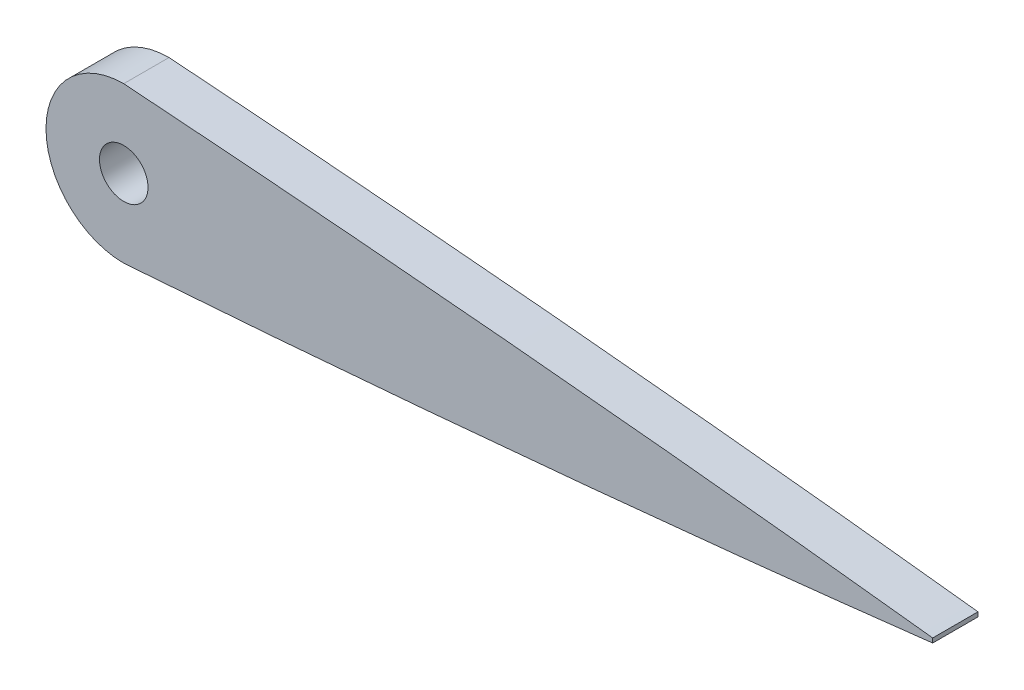
ISO-10303-21;
HEADER;
FILE_DESCRIPTION(('STEP AP214'),'2;1');
FILE_NAME('part.step','',(''),(''),'','','');
FILE_SCHEMA(('AUTOMOTIVE_DESIGN { 1 0 10303 214 1 1 1 1 }'));
ENDSEC;
DATA;
#1=APPLICATION_CONTEXT('core data for automotive mechanical design processes');
#2=APPLICATION_PROTOCOL_DEFINITION('international standard','automotive_design',2000,#1);
#3=PRODUCT_CONTEXT('',#1,'mechanical');
#4=PRODUCT('Part','Part','',(#3));
#5=PRODUCT_RELATED_PRODUCT_CATEGORY('part','',(#4));
#6=PRODUCT_DEFINITION_FORMATION('','',#4);
#7=PRODUCT_DEFINITION_CONTEXT('part definition',#1,'design');
#8=PRODUCT_DEFINITION('design','',#6,#7);
#9=PRODUCT_DEFINITION_SHAPE('','',#8);
#10=(LENGTH_UNIT() NAMED_UNIT(*) SI_UNIT(.MILLI.,.METRE.));
#11=(NAMED_UNIT(*) PLANE_ANGLE_UNIT() SI_UNIT($,.RADIAN.));
#12=(NAMED_UNIT(*) SI_UNIT($,.STERADIAN.) SOLID_ANGLE_UNIT());
#13=UNCERTAINTY_MEASURE_WITH_UNIT(LENGTH_MEASURE(1.E-05),#10,'distance_accuracy_value','');
#14=(GEOMETRIC_REPRESENTATION_CONTEXT(3) GLOBAL_UNCERTAINTY_ASSIGNED_CONTEXT((#13)) GLOBAL_UNIT_ASSIGNED_CONTEXT((#10,
#11,#12)) REPRESENTATION_CONTEXT('',''));
#15=CARTESIAN_POINT('',(0.,0.,0.));
#16=DIRECTION('',(0.,0.,1.));
#17=DIRECTION('',(1.,0.,0.));
#18=AXIS2_PLACEMENT_3D('',#15,#16,#17);
#19=CARTESIAN_POINT('',(150.,0.,1.4));
#20=DIRECTION('',(0.,0.,-1.));
#21=DIRECTION('',(-1.,0.,0.));
#22=AXIS2_PLACEMENT_3D('',#19,#20,#21);
#23=CYLINDRICAL_SURFACE('',#22,4.80461384587043);
#24=CARTESIAN_POINT('',(150.,0.,-1.4));
#25=DIRECTION('',(0.,0.,1.));
#26=DIRECTION('',(1.,0.,0.));
#27=AXIS2_PLACEMENT_3D('',#24,#25,#26);
#28=CIRCLE('',#27,4.80461384587043);
#29=CARTESIAN_POINT('',(150.,4.80461384587043,-1.4));
#30=VERTEX_POINT('',#29);
#31=CARTESIAN_POINT('',(150.,-4.80461384587043,-1.4));
#32=VERTEX_POINT('',#31);
#33=EDGE_CURVE('E136',#30,#32,#28,.T.);
#34=ORIENTED_EDGE('',*,*,#33,.T.);
#35=DIRECTION('',(0.,0.,-1.));
#36=VECTOR('',#35,1.);
#37=CARTESIAN_POINT('',(150.,-4.80461384587043,1.4));
#38=LINE('',#37,#36);
#39=CARTESIAN_POINT('',(150.,-4.80461384587043,1.4));
#40=VERTEX_POINT('',#39);
#41=EDGE_CURVE('E11',#40,#32,#38,.T.);
#42=ORIENTED_EDGE('',*,*,#41,.F.);
#43=CARTESIAN_POINT('',(150.,0.,1.4));
#44=DIRECTION('',(0.,0.,1.));
#45=DIRECTION('',(1.,0.,0.));
#46=AXIS2_PLACEMENT_3D('',#43,#44,#45);
#47=CIRCLE('',#46,4.80461384587043);
#48=CARTESIAN_POINT('',(150.,4.80461384587043,1.4));
#49=VERTEX_POINT('',#48);
#50=EDGE_CURVE('E90',#49,#40,#47,.T.);
#51=ORIENTED_EDGE('',*,*,#50,.F.);
#52=DIRECTION('',(0.,0.,-1.));
#53=VECTOR('',#52,1.);
#54=CARTESIAN_POINT('',(150.,4.80461384587043,1.4));
#55=LINE('',#54,#53);
#56=EDGE_CURVE('E105',#49,#30,#55,.T.);
#57=ORIENTED_EDGE('',*,*,#56,.T.);
#58=EDGE_LOOP('',(#34,#42,#51,#57));
#59=FACE_BOUND('',#58,.T.);
#60=ADVANCED_FACE('F41',(#59),#23,.T.);
#61=CARTESIAN_POINT('',(70.,0.,1.4));
#62=CARTESIAN_POINT('',(70.0210891933104,-0.181022277756236,1.4));
#63=CARTESIAN_POINT('',(70.0654115784545,-0.561470168591621,1.4));
#64=CARTESIAN_POINT('',(70.4054651376767,-1.09128863854025,1.4));
#65=CARTESIAN_POINT('',(70.9148454368871,-1.58948341349259,1.4));
#66=CARTESIAN_POINT('',(71.6134039414976,-2.06570488459065,1.4));
#67=CARTESIAN_POINT('',(72.4904852213431,-2.52300118187618,1.4));
#68=CARTESIAN_POINT('',(73.5466597857126,-2.96175212088492,1.4));
#69=CARTESIAN_POINT('',(74.777626786561,-3.38106476585515,1.4));
#70=CARTESIAN_POINT('',(76.1798269249892,-3.77961054900821,1.4));
#71=CARTESIAN_POINT('',(77.7488483274916,-4.15602159944256,1.4));
#72=CARTESIAN_POINT('',(79.480180391605,-4.50879808021636,1.4));
#73=CARTESIAN_POINT('',(81.3690703368048,-4.83650935330272,1.4));
#74=CARTESIAN_POINT('',(83.4106173030528,-5.13779143733033,1.4));
#75=CARTESIAN_POINT('',(85.5997871715192,-5.41138329617955,1.4));
#76=CARTESIAN_POINT('',(87.9314069199584,-5.65613219952653,1.4));
#77=CARTESIAN_POINT('',(90.4001654328243,-5.87110935567024,1.4));
#78=CARTESIAN_POINT('',(93.0006274247381,-6.05546036807817,1.4));
#79=CARTESIAN_POINT('',(95.7272036399974,-6.20862837049385,1.4));
#80=CARTESIAN_POINT('',(98.5741712322572,-6.3302245705325,1.4));
#81=CARTESIAN_POINT('',(101.535643119364,-6.42009288153795,1.4));
#82=CARTESIAN_POINT('',(104.60557157804,-6.47822791192431,1.4));
#83=CARTESIAN_POINT('',(107.777727308731,-6.50498815144425,1.4));
#84=CARTESIAN_POINT('',(111.04570099436,-6.5007667704824,1.4));
#85=CARTESIAN_POINT('',(114.40287335376,-6.4663175065826,1.4));
#86=CARTESIAN_POINT('',(117.842409031342,-6.40248972539943,1.4));
#87=CARTESIAN_POINT('',(121.357229155619,-6.31032058029897,1.4));
#88=CARTESIAN_POINT('',(124.940008831239,-6.19102708290984,1.4));
#89=CARTESIAN_POINT('',(128.583123626476,-6.04593163572366,1.4));
#90=CARTESIAN_POINT('',(132.278649950781,-5.8764622181101,1.4));
#91=CARTESIAN_POINT('',(136.018308786906,-5.68413937527898,1.4));
#92=CARTESIAN_POINT('',(139.793458583577,-5.47057350130732,1.4));
#93=CARTESIAN_POINT('',(143.595021076551,-5.23737347030647,1.4));
#94=CARTESIAN_POINT('',(147.413453453648,-4.98624509086135,1.4));
#95=CARTESIAN_POINT('',(151.238665748325,-4.71889644121469,1.4));
#96=CARTESIAN_POINT('',(155.059961592094,-4.43701048082576,1.4));
#97=CARTESIAN_POINT('',(158.865943792714,-4.14237984950792,1.4));
#98=CARTESIAN_POINT('',(162.644406172511,-3.83679790200338,1.4));
#99=CARTESIAN_POINT('',(166.382173560786,-3.52209133734546,1.4));
#100=CARTESIAN_POINT('',(170.064960651326,-3.2002273198148,1.4));
#101=CARTESIAN_POINT('',(173.677095759027,-2.87328435938489,1.4));
#102=CARTESIAN_POINT('',(177.201238614807,-2.54359186690204,1.4));
#103=CARTESIAN_POINT('',(180.617922245882,-2.21370342378747,1.4));
#104=CARTESIAN_POINT('',(183.904963564941,-1.88667328178701,1.4));
#105=CARTESIAN_POINT('',(187.036509642164,-1.56600799118508,1.4));
#106=CARTESIAN_POINT('',(189.981579717866,-1.25611146784962,1.4));
#107=CARTESIAN_POINT('',(192.701519493011,-0.962451868277504,1.4));
#108=CARTESIAN_POINT('',(195.145010046257,-0.6922914971175,1.4));
#109=CARTESIAN_POINT('',(197.235914613454,-0.45609848618737,1.4));
#110=CARTESIAN_POINT('',(198.816691219591,-0.274497570057536,1.4));
#111=CARTESIAN_POINT('',(199.688033420455,-0.17288156889324,1.4));
#112=CARTESIAN_POINT('',(200.,-0.1365,1.4));
#113=B_SPLINE_CURVE_WITH_KNOTS('',3,(#61,#62,#63,#64,#65,#66,#67,#68,#69,#70,#71,#72,#73,#74,
#75,#76,#77,#78,#79,#80,#81,#82,#83,#84,#85,#86,#87,#88,#89,#90,#91,#92,#93,#94,#95,#96,#97,#98,
#99,#100,#101,#102,#103,#104,#105,#106,#107,#108,#109,#110,#111,#112),.UNSPECIFIED.,.F.,.F.,(4,
1,1,1,1,1,1,1,1,1,1,1,1,1,1,1,1,1,1,1,1,1,1,1,1,1,1,1,1,1,1,1,1,1,1,1,1,1,1,1,1,1,1,1,1,1,1,1,1,
4),(0.,0.00409901119627067,0.00861474169622243,0.013934854724959,0.0202777746115639,
0.0277529807018305,0.0364102145151919,0.0462664329749759,0.057320237837208,0.0695589461393541,
0.0829628608595683,0.0975072182865541,0.113164081930894,0.129902689855954,0.147690303906216,
0.166492184642367,0.186271967143026,0.206991861424857,0.228612214931178,0.25109216492606,
0.274388983443375,0.298458209116087,0.323253842050884,0.348727970896163,0.374830386774719,
0.401509190431855,0.428710015672103,0.456376153594157,0.484448082863221,0.512863886613239,
0.541558094079446,0.570462312854758,0.599504247573885,0.628607348748546,0.657690446050344,
0.68666723740018,0.715444848929875,0.743923546361862,0.771994829811623,0.799540252867686,
0.826428321931678,0.852512114582347,0.877624445997917,0.901571133904992,0.924121062493777,
0.944988816236939,0.963803938777258,0.980044339265456,0.992855276358985,1.),.UNSPECIFIED.);
#114=DIRECTION('',(0.,0.,-1.));
#115=VECTOR('',#114,1.);
#116=SURFACE_OF_LINEAR_EXTRUSION('',#113,#115);
#117=CARTESIAN_POINT('',(70.,0.,-1.4));
#118=CARTESIAN_POINT('',(70.0210891933104,-0.181022277756236,-1.4));
#119=CARTESIAN_POINT('',(70.0654115784545,-0.561470168591621,-1.4));
#120=CARTESIAN_POINT('',(70.4054651376767,-1.09128863854025,-1.4));
#121=CARTESIAN_POINT('',(70.9148454368871,-1.58948341349259,-1.4));
#122=CARTESIAN_POINT('',(71.6134039414976,-2.06570488459065,-1.4));
#123=CARTESIAN_POINT('',(72.4904852213431,-2.52300118187618,-1.4));
#124=CARTESIAN_POINT('',(73.5466597857126,-2.96175212088492,-1.4));
#125=CARTESIAN_POINT('',(74.777626786561,-3.38106476585515,-1.4));
#126=CARTESIAN_POINT('',(76.1798269249892,-3.77961054900821,-1.4));
#127=CARTESIAN_POINT('',(77.7488483274916,-4.15602159944256,-1.4));
#128=CARTESIAN_POINT('',(79.480180391605,-4.50879808021636,-1.4));
#129=CARTESIAN_POINT('',(81.3690703368048,-4.83650935330272,-1.4));
#130=CARTESIAN_POINT('',(83.4106173030528,-5.13779143733033,-1.4));
#131=CARTESIAN_POINT('',(85.5997871715192,-5.41138329617955,-1.4));
#132=CARTESIAN_POINT('',(87.9314069199584,-5.65613219952653,-1.4));
#133=CARTESIAN_POINT('',(90.4001654328243,-5.87110935567024,-1.4));
#134=CARTESIAN_POINT('',(93.0006274247381,-6.05546036807817,-1.4));
#135=CARTESIAN_POINT('',(95.7272036399974,-6.20862837049385,-1.4));
#136=CARTESIAN_POINT('',(98.5741712322572,-6.3302245705325,-1.4));
#137=CARTESIAN_POINT('',(101.535643119364,-6.42009288153795,-1.4));
#138=CARTESIAN_POINT('',(104.60557157804,-6.47822791192431,-1.4));
#139=CARTESIAN_POINT('',(107.777727308731,-6.50498815144425,-1.4));
#140=CARTESIAN_POINT('',(111.04570099436,-6.5007667704824,-1.4));
#141=CARTESIAN_POINT('',(114.40287335376,-6.4663175065826,-1.4));
#142=CARTESIAN_POINT('',(117.842409031342,-6.40248972539943,-1.4));
#143=CARTESIAN_POINT('',(121.357229155619,-6.31032058029897,-1.4));
#144=CARTESIAN_POINT('',(124.940008831239,-6.19102708290984,-1.4));
#145=CARTESIAN_POINT('',(128.583123626476,-6.04593163572366,-1.4));
#146=CARTESIAN_POINT('',(132.278649950781,-5.8764622181101,-1.4));
#147=CARTESIAN_POINT('',(136.018308786906,-5.68413937527898,-1.4));
#148=CARTESIAN_POINT('',(139.793458583577,-5.47057350130732,-1.4));
#149=CARTESIAN_POINT('',(143.595021076551,-5.23737347030647,-1.4));
#150=CARTESIAN_POINT('',(147.413453453648,-4.98624509086135,-1.4));
#151=CARTESIAN_POINT('',(151.238665748325,-4.71889644121469,-1.4));
#152=CARTESIAN_POINT('',(155.059961592094,-4.43701048082576,-1.4));
#153=CARTESIAN_POINT('',(158.865943792714,-4.14237984950792,-1.4));
#154=CARTESIAN_POINT('',(162.644406172511,-3.83679790200338,-1.4));
#155=CARTESIAN_POINT('',(166.382173560786,-3.52209133734546,-1.4));
#156=CARTESIAN_POINT('',(170.064960651326,-3.2002273198148,-1.4));
#157=CARTESIAN_POINT('',(173.677095759027,-2.87328435938489,-1.4));
#158=CARTESIAN_POINT('',(177.201238614807,-2.54359186690204,-1.4));
#159=CARTESIAN_POINT('',(180.617922245882,-2.21370342378747,-1.4));
#160=CARTESIAN_POINT('',(183.904963564941,-1.88667328178701,-1.4));
#161=CARTESIAN_POINT('',(187.036509642164,-1.56600799118508,-1.4));
#162=CARTESIAN_POINT('',(189.981579717866,-1.25611146784962,-1.4));
#163=CARTESIAN_POINT('',(192.701519493011,-0.962451868277504,-1.4));
#164=CARTESIAN_POINT('',(195.145010046257,-0.6922914971175,-1.4));
#165=CARTESIAN_POINT('',(197.235914613454,-0.45609848618737,-1.4));
#166=CARTESIAN_POINT('',(198.816691219591,-0.274497570057536,-1.4));
#167=CARTESIAN_POINT('',(199.688033420455,-0.17288156889324,-1.4));
#168=CARTESIAN_POINT('',(200.,-0.1365,-1.4));
#169=B_SPLINE_CURVE_WITH_KNOTS('',3,(#117,#118,#119,#120,#121,#122,#123,#124,#125,#126,#127,
#128,#129,#130,#131,#132,#133,#134,#135,#136,#137,#138,#139,#140,#141,#142,#143,#144,#145,#146,
#147,#148,#149,#150,#151,#152,#153,#154,#155,#156,#157,#158,#159,#160,#161,#162,#163,#164,#165,
#166,#167,#168),.UNSPECIFIED.,.F.,.F.,(4,1,1,1,1,1,1,1,1,1,1,1,1,1,1,1,1,1,1,1,1,1,1,1,1,1,1,1,
1,1,1,1,1,1,1,1,1,1,1,1,1,1,1,1,1,1,1,1,1,4),(0.,0.00409901119627067,0.00861474169622243,
0.013934854724959,0.0202777746115639,0.0277529807018305,0.0364102145151919,0.0462664329749759,
0.057320237837208,0.0695589461393541,0.0829628608595683,0.0975072182865541,0.113164081930894,
0.129902689855954,0.147690303906216,0.166492184642367,0.186271967143026,0.206991861424857,
0.228612214931178,0.25109216492606,0.274388983443375,0.298458209116087,0.323253842050884,
0.348727970896163,0.374830386774719,0.401509190431855,0.428710015672103,0.456376153594157,
0.484448082863221,0.512863886613239,0.541558094079446,0.570462312854758,0.599504247573885,
0.628607348748546,0.657690446050344,0.68666723740018,0.715444848929875,0.743923546361862,
0.771994829811623,0.799540252867686,0.826428321931678,0.852512114582347,0.877624445997917,
0.901571133904992,0.924121062493777,0.944988816236939,0.963803938777258,0.980044339265456,
0.992855276358985,1.),.UNSPECIFIED.);
#170=CARTESIAN_POINT('',(200.,-0.1365,-1.4));
#171=VERTEX_POINT('',#170);
#172=EDGE_CURVE('E96',#32,#171,#169,.T.);
#173=ORIENTED_EDGE('',*,*,#172,.T.);
#174=DIRECTION('',(0.,0.,-1.));
#175=VECTOR('',#174,1.);
#176=CARTESIAN_POINT('',(200.,-0.1365,1.4));
#177=LINE('',#176,#175);
#178=CARTESIAN_POINT('',(200.,-0.1365,1.4));
#179=VERTEX_POINT('',#178);
#180=EDGE_CURVE('E51',#179,#171,#177,.T.);
#181=ORIENTED_EDGE('',*,*,#180,.F.);
#182=EDGE_CURVE('E85',#40,#179,#113,.T.);
#183=ORIENTED_EDGE('',*,*,#182,.F.);
#184=ORIENTED_EDGE('',*,*,#41,.T.);
#185=EDGE_LOOP('',(#173,#181,#183,#184));
#186=FACE_BOUND('',#185,.T.);
#187=ADVANCED_FACE('F95',(#186),#116,.F.);
#188=CARTESIAN_POINT('',(200.,0.,1.4));
#189=DIRECTION('',(1.,0.,0.));
#190=DIRECTION('',(0.,0.,-1.));
#191=AXIS2_PLACEMENT_3D('',#188,#189,#190);
#192=PLANE('',#191);
#193=DIRECTION('',(0.,-1.,0.));
#194=VECTOR('',#193,1.);
#195=CARTESIAN_POINT('',(200.,0.,-1.4));
#196=LINE('',#195,#194);
#197=CARTESIAN_POINT('',(200.,0.1365,-1.4));
#198=VERTEX_POINT('',#197);
#199=EDGE_CURVE('E141',#198,#171,#196,.T.);
#200=ORIENTED_EDGE('',*,*,#199,.F.);
#201=DIRECTION('',(0.,0.,-1.));
#202=VECTOR('',#201,1.);
#203=CARTESIAN_POINT('',(200.,0.1365,1.4));
#204=LINE('',#203,#202);
#205=CARTESIAN_POINT('',(200.,0.1365,1.4));
#206=VERTEX_POINT('',#205);
#207=EDGE_CURVE('E75',#206,#198,#204,.T.);
#208=ORIENTED_EDGE('',*,*,#207,.F.);
#209=DIRECTION('',(0.,-1.,0.));
#210=VECTOR('',#209,1.);
#211=CARTESIAN_POINT('',(200.,0.,1.4));
#212=LINE('',#211,#210);
#213=EDGE_CURVE('E88',#206,#179,#212,.T.);
#214=ORIENTED_EDGE('',*,*,#213,.T.);
#215=ORIENTED_EDGE('',*,*,#180,.T.);
#216=EDGE_LOOP('',(#200,#208,#214,#215));
#217=FACE_BOUND('',#216,.T.);
#218=ADVANCED_FACE('F101',(#217),#192,.T.);
#219=CARTESIAN_POINT('',(150.,0.,1.4));
#220=DIRECTION('',(0.,0.,-1.));
#221=DIRECTION('',(-1.,0.,0.));
#222=AXIS2_PLACEMENT_3D('',#219,#220,#221);
#223=CYLINDRICAL_SURFACE('',#222,1.5);
#224=CARTESIAN_POINT('',(150.,0.,1.4));
#225=DIRECTION('',(0.,0.,1.));
#226=DIRECTION('',(1.,0.,0.));
#227=AXIS2_PLACEMENT_3D('',#224,#225,#226);
#228=CIRCLE('',#227,1.5);
#229=CARTESIAN_POINT('',(151.5,0.,1.4));
#230=VERTEX_POINT('',#229);
#231=EDGE_CURVE('E156',#230,#230,#228,.T.);
#232=ORIENTED_EDGE('',*,*,#231,.T.);
#233=EDGE_LOOP('',(#232));
#234=FACE_BOUND('',#233,.T.);
#235=CARTESIAN_POINT('',(150.,0.,-1.4));
#236=DIRECTION('',(0.,0.,1.));
#237=DIRECTION('',(1.,0.,0.));
#238=AXIS2_PLACEMENT_3D('',#235,#236,#237);
#239=CIRCLE('',#238,1.5);
#240=CARTESIAN_POINT('',(151.5,0.,-1.4));
#241=VERTEX_POINT('',#240);
#242=EDGE_CURVE('E115',#241,#241,#239,.T.);
#243=ORIENTED_EDGE('',*,*,#242,.F.);
#244=EDGE_LOOP('',(#243));
#245=FACE_BOUND('',#244,.T.);
#246=ADVANCED_FACE('F43',(#234,#245),#223,.F.);
#247=CARTESIAN_POINT('',(200.,0.1365,1.4));
#248=CARTESIAN_POINT('',(199.688033420454,0.17288156889324,1.4));
#249=CARTESIAN_POINT('',(198.816691219591,0.274497570057535,1.4));
#250=CARTESIAN_POINT('',(197.235914613454,0.456098486187371,1.4));
#251=CARTESIAN_POINT('',(195.145010046257,0.692291497117497,1.4));
#252=CARTESIAN_POINT('',(192.701519493011,0.962451868277506,1.4));
#253=CARTESIAN_POINT('',(189.981579717866,1.25611146784961,1.4));
#254=CARTESIAN_POINT('',(187.036509642164,1.56600799118508,1.4));
#255=CARTESIAN_POINT('',(183.904963564941,1.88667328178701,1.4));
#256=CARTESIAN_POINT('',(180.617922245882,2.21370342378747,1.4));
#257=CARTESIAN_POINT('',(177.201238614807,2.54359186690204,1.4));
#258=CARTESIAN_POINT('',(173.677095759027,2.87328435938489,1.4));
#259=CARTESIAN_POINT('',(170.064960651326,3.2002273198148,1.4));
#260=CARTESIAN_POINT('',(166.382173560786,3.52209133734546,1.4));
#261=CARTESIAN_POINT('',(162.644406172511,3.83679790200338,1.4));
#262=CARTESIAN_POINT('',(158.865943792714,4.14237984950792,1.4));
#263=CARTESIAN_POINT('',(155.059961592094,4.43701048082577,1.4));
#264=CARTESIAN_POINT('',(151.238665748325,4.71889644121469,1.4));
#265=CARTESIAN_POINT('',(147.413453453648,4.98624509086135,1.4));
#266=CARTESIAN_POINT('',(143.595021076551,5.23737347030647,1.4));
#267=CARTESIAN_POINT('',(139.793458583577,5.47057350130731,1.4));
#268=CARTESIAN_POINT('',(136.018308786906,5.68413937527898,1.4));
#269=CARTESIAN_POINT('',(132.278649950781,5.87646221811009,1.4));
#270=CARTESIAN_POINT('',(128.583123626476,6.04593163572366,1.4));
#271=CARTESIAN_POINT('',(124.940008831239,6.19102708290984,1.4));
#272=CARTESIAN_POINT('',(121.357229155619,6.31032058029897,1.4));
#273=CARTESIAN_POINT('',(117.842409031342,6.40248972539943,1.4));
#274=CARTESIAN_POINT('',(114.40287335376,6.4663175065826,1.4));
#275=CARTESIAN_POINT('',(111.04570099436,6.5007667704824,1.4));
#276=CARTESIAN_POINT('',(107.777727308731,6.50498815144425,1.4));
#277=CARTESIAN_POINT('',(104.60557157804,6.47822791192431,1.4));
#278=CARTESIAN_POINT('',(101.535643119364,6.42009288153795,1.4));
#279=CARTESIAN_POINT('',(98.5741712322572,6.3302245705325,1.4));
#280=CARTESIAN_POINT('',(95.7272036399975,6.20862837049385,1.4));
#281=CARTESIAN_POINT('',(93.0006274247381,6.05546036807817,1.4));
#282=CARTESIAN_POINT('',(90.4001654328244,5.87110935567025,1.4));
#283=CARTESIAN_POINT('',(87.9314069199584,5.65613219952653,1.4));
#284=CARTESIAN_POINT('',(85.5997871715192,5.41138329617954,1.4));
#285=CARTESIAN_POINT('',(83.4106173030528,5.13779143733033,1.4));
#286=CARTESIAN_POINT('',(81.3690703368048,4.83650935330272,1.4));
#287=CARTESIAN_POINT('',(79.480180391605,4.50879808021636,1.4));
#288=CARTESIAN_POINT('',(77.7488483274916,4.15602159944257,1.4));
#289=CARTESIAN_POINT('',(76.1798269249892,3.7796105490082,1.4));
#290=CARTESIAN_POINT('',(74.777626786561,3.38106476585516,1.4));
#291=CARTESIAN_POINT('',(73.5466597857126,2.96175212088491,1.4));
#292=CARTESIAN_POINT('',(72.4904852213431,2.52300118187618,1.4));
#293=CARTESIAN_POINT('',(71.6134039414976,2.06570488459065,1.4));
#294=CARTESIAN_POINT('',(70.9148454368871,1.5894834134926,1.4));
#295=CARTESIAN_POINT('',(70.4054651376767,1.09128863854026,1.4));
#296=CARTESIAN_POINT('',(70.0654115784545,0.561470168591609,1.4));
#297=CARTESIAN_POINT('',(70.0210891933104,0.181022277756235,1.4));
#298=CARTESIAN_POINT('',(70.,0.,1.4));
#299=B_SPLINE_CURVE_WITH_KNOTS('',3,(#247,#248,#249,#250,#251,#252,#253,#254,#255,#256,#257,
#258,#259,#260,#261,#262,#263,#264,#265,#266,#267,#268,#269,#270,#271,#272,#273,#274,#275,#276,
#277,#278,#279,#280,#281,#282,#283,#284,#285,#286,#287,#288,#289,#290,#291,#292,#293,#294,#295,
#296,#297,#298),.UNSPECIFIED.,.F.,.F.,(4,1,1,1,1,1,1,1,1,1,1,1,1,1,1,1,1,1,1,1,1,1,1,1,1,1,1,1,
1,1,1,1,1,1,1,1,1,1,1,1,1,1,1,1,1,1,1,1,1,4),(0.,0.00714472364101508,0.0199556607345445,
0.0361960612227423,0.0550111837630615,0.0758789375062231,0.0984288660950084,0.122375554002083,
0.147487885417653,0.173571678068322,0.200459747132314,0.228005170188377,0.256076453638138,
0.284555151070125,0.31333276259982,0.342309553949656,0.371392651251454,0.400495752426115,
0.429537687145242,0.458441905920554,0.487136113386761,0.515551917136779,0.543623846405843,
0.571289984327897,0.598490809568145,0.625169613225281,0.651272029103837,0.676746157949116,
0.701541790883913,0.725611016556625,0.74890783507394,0.771387785068822,0.793008138575143,
0.813728032856974,0.833507815357633,0.852309696093784,0.870097310144046,0.886835918069106,
0.902492781713446,0.917037139140432,0.930441053860646,0.942679762162792,0.953733567025024,
0.963589785484808,0.972247019298169,0.979722225388436,0.986065145275041,0.991385258303778,
0.995900988803729,1.),.UNSPECIFIED.);
#300=DIRECTION('',(0.,0.,-1.));
#301=VECTOR('',#300,1.);
#302=SURFACE_OF_LINEAR_EXTRUSION('',#299,#301);
#303=CARTESIAN_POINT('',(200.,0.1365,-1.4));
#304=CARTESIAN_POINT('',(199.688033420454,0.17288156889324,-1.4));
#305=CARTESIAN_POINT('',(198.816691219591,0.274497570057535,-1.4));
#306=CARTESIAN_POINT('',(197.235914613454,0.456098486187371,-1.4));
#307=CARTESIAN_POINT('',(195.145010046257,0.692291497117497,-1.4));
#308=CARTESIAN_POINT('',(192.701519493011,0.962451868277506,-1.4));
#309=CARTESIAN_POINT('',(189.981579717866,1.25611146784961,-1.4));
#310=CARTESIAN_POINT('',(187.036509642164,1.56600799118508,-1.4));
#311=CARTESIAN_POINT('',(183.904963564941,1.88667328178701,-1.4));
#312=CARTESIAN_POINT('',(180.617922245882,2.21370342378747,-1.4));
#313=CARTESIAN_POINT('',(177.201238614807,2.54359186690204,-1.4));
#314=CARTESIAN_POINT('',(173.677095759027,2.87328435938489,-1.4));
#315=CARTESIAN_POINT('',(170.064960651326,3.2002273198148,-1.4));
#316=CARTESIAN_POINT('',(166.382173560786,3.52209133734546,-1.4));
#317=CARTESIAN_POINT('',(162.644406172511,3.83679790200338,-1.4));
#318=CARTESIAN_POINT('',(158.865943792714,4.14237984950792,-1.4));
#319=CARTESIAN_POINT('',(155.059961592094,4.43701048082577,-1.4));
#320=CARTESIAN_POINT('',(151.238665748325,4.71889644121469,-1.4));
#321=CARTESIAN_POINT('',(147.413453453648,4.98624509086135,-1.4));
#322=CARTESIAN_POINT('',(143.595021076551,5.23737347030647,-1.4));
#323=CARTESIAN_POINT('',(139.793458583577,5.47057350130731,-1.4));
#324=CARTESIAN_POINT('',(136.018308786906,5.68413937527898,-1.4));
#325=CARTESIAN_POINT('',(132.278649950781,5.87646221811009,-1.4));
#326=CARTESIAN_POINT('',(128.583123626476,6.04593163572366,-1.4));
#327=CARTESIAN_POINT('',(124.940008831239,6.19102708290984,-1.4));
#328=CARTESIAN_POINT('',(121.357229155619,6.31032058029897,-1.4));
#329=CARTESIAN_POINT('',(117.842409031342,6.40248972539943,-1.4));
#330=CARTESIAN_POINT('',(114.40287335376,6.4663175065826,-1.4));
#331=CARTESIAN_POINT('',(111.04570099436,6.5007667704824,-1.4));
#332=CARTESIAN_POINT('',(107.777727308731,6.50498815144425,-1.4));
#333=CARTESIAN_POINT('',(104.60557157804,6.47822791192431,-1.4));
#334=CARTESIAN_POINT('',(101.535643119364,6.42009288153795,-1.4));
#335=CARTESIAN_POINT('',(98.5741712322572,6.3302245705325,-1.4));
#336=CARTESIAN_POINT('',(95.7272036399975,6.20862837049385,-1.4));
#337=CARTESIAN_POINT('',(93.0006274247381,6.05546036807817,-1.4));
#338=CARTESIAN_POINT('',(90.4001654328244,5.87110935567025,-1.4));
#339=CARTESIAN_POINT('',(87.9314069199584,5.65613219952653,-1.4));
#340=CARTESIAN_POINT('',(85.5997871715192,5.41138329617954,-1.4));
#341=CARTESIAN_POINT('',(83.4106173030528,5.13779143733033,-1.4));
#342=CARTESIAN_POINT('',(81.3690703368048,4.83650935330272,-1.4));
#343=CARTESIAN_POINT('',(79.480180391605,4.50879808021636,-1.4));
#344=CARTESIAN_POINT('',(77.7488483274916,4.15602159944257,-1.4));
#345=CARTESIAN_POINT('',(76.1798269249892,3.7796105490082,-1.4));
#346=CARTESIAN_POINT('',(74.777626786561,3.38106476585516,-1.4));
#347=CARTESIAN_POINT('',(73.5466597857126,2.96175212088491,-1.4));
#348=CARTESIAN_POINT('',(72.4904852213431,2.52300118187618,-1.4));
#349=CARTESIAN_POINT('',(71.6134039414976,2.06570488459065,-1.4));
#350=CARTESIAN_POINT('',(70.9148454368871,1.5894834134926,-1.4));
#351=CARTESIAN_POINT('',(70.4054651376767,1.09128863854026,-1.4));
#352=CARTESIAN_POINT('',(70.0654115784545,0.561470168591609,-1.4));
#353=CARTESIAN_POINT('',(70.0210891933104,0.181022277756235,-1.4));
#354=CARTESIAN_POINT('',(70.,0.,-1.4));
#355=B_SPLINE_CURVE_WITH_KNOTS('',3,(#303,#304,#305,#306,#307,#308,#309,#310,#311,#312,#313,
#314,#315,#316,#317,#318,#319,#320,#321,#322,#323,#324,#325,#326,#327,#328,#329,#330,#331,#332,
#333,#334,#335,#336,#337,#338,#339,#340,#341,#342,#343,#344,#345,#346,#347,#348,#349,#350,#351,
#352,#353,#354),.UNSPECIFIED.,.F.,.F.,(4,1,1,1,1,1,1,1,1,1,1,1,1,1,1,1,1,1,1,1,1,1,1,1,1,1,1,1,
1,1,1,1,1,1,1,1,1,1,1,1,1,1,1,1,1,1,1,1,1,4),(0.,0.00714472364101508,0.0199556607345445,
0.0361960612227423,0.0550111837630615,0.0758789375062231,0.0984288660950084,0.122375554002083,
0.147487885417653,0.173571678068322,0.200459747132314,0.228005170188377,0.256076453638138,
0.284555151070125,0.31333276259982,0.342309553949656,0.371392651251454,0.400495752426115,
0.429537687145242,0.458441905920554,0.487136113386761,0.515551917136779,0.543623846405843,
0.571289984327897,0.598490809568145,0.625169613225281,0.651272029103837,0.676746157949116,
0.701541790883913,0.725611016556625,0.74890783507394,0.771387785068822,0.793008138575143,
0.813728032856974,0.833507815357633,0.852309696093784,0.870097310144046,0.886835918069106,
0.902492781713446,0.917037139140432,0.930441053860646,0.942679762162792,0.953733567025024,
0.963589785484808,0.972247019298169,0.979722225388436,0.986065145275041,0.991385258303778,
0.995900988803729,1.),.UNSPECIFIED.);
#356=EDGE_CURVE('E78',#198,#30,#355,.T.);
#357=ORIENTED_EDGE('',*,*,#356,.T.);
#358=ORIENTED_EDGE('',*,*,#56,.F.);
#359=EDGE_CURVE('E59',#206,#49,#299,.T.);
#360=ORIENTED_EDGE('',*,*,#359,.F.);
#361=ORIENTED_EDGE('',*,*,#207,.T.);
#362=EDGE_LOOP('',(#357,#358,#360,#361));
#363=FACE_BOUND('',#362,.T.);
#364=ADVANCED_FACE('F121',(#363),#302,.F.);
#365=CARTESIAN_POINT('',(0.,0.,1.4));
#366=DIRECTION('',(0.,0.,1.));
#367=DIRECTION('',(1.,0.,0.));
#368=AXIS2_PLACEMENT_3D('',#365,#366,#367);
#369=PLANE('',#368);
#370=ORIENTED_EDGE('',*,*,#231,.F.);
#371=EDGE_LOOP('',(#370));
#372=FACE_BOUND('',#371,.T.);
#373=ORIENTED_EDGE('',*,*,#50,.T.);
#374=ORIENTED_EDGE('',*,*,#182,.T.);
#375=ORIENTED_EDGE('',*,*,#213,.F.);
#376=ORIENTED_EDGE('',*,*,#359,.T.);
#377=EDGE_LOOP('',(#373,#374,#375,#376));
#378=FACE_BOUND('',#377,.T.);
#379=ADVANCED_FACE('F86',(#372,#378),#369,.T.);
#380=CARTESIAN_POINT('',(0.,0.,-1.4));
#381=DIRECTION('',(0.,0.,1.));
#382=DIRECTION('',(1.,0.,0.));
#383=AXIS2_PLACEMENT_3D('',#380,#381,#382);
#384=PLANE('',#383);
#385=ORIENTED_EDGE('',*,*,#242,.T.);
#386=EDGE_LOOP('',(#385));
#387=FACE_BOUND('',#386,.T.);
#388=ORIENTED_EDGE('',*,*,#33,.F.);
#389=ORIENTED_EDGE('',*,*,#356,.F.);
#390=ORIENTED_EDGE('',*,*,#199,.T.);
#391=ORIENTED_EDGE('',*,*,#172,.F.);
#392=EDGE_LOOP('',(#388,#389,#390,#391));
#393=FACE_BOUND('',#392,.T.);
#394=ADVANCED_FACE('F125',(#387,#393),#384,.F.);
#395=CLOSED_SHELL('',(#60,#187,#218,#246,#364,#379,#394));
#396=MANIFOLD_SOLID_BREP('B2',#395);
#397=ADVANCED_BREP_SHAPE_REPRESENTATION('',(#18,#396),#14);
#398=SHAPE_DEFINITION_REPRESENTATION(#9,#397);
ENDSEC;
END-ISO-10303-21;
